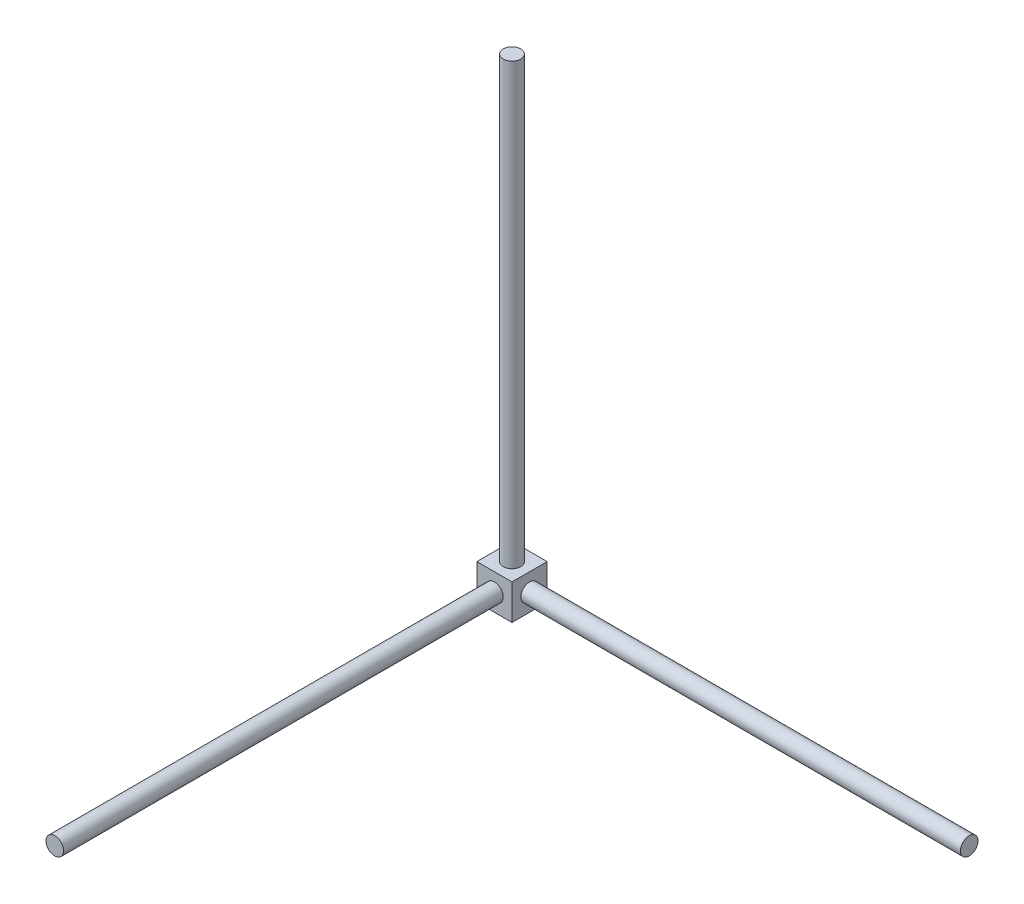
ISO-10303-21;
HEADER;
FILE_DESCRIPTION(('STEP AP214'),'2;1');
FILE_NAME('part.step','',(''),(''),'','','');
FILE_SCHEMA(('AUTOMOTIVE_DESIGN { 1 0 10303 214 1 1 1 1 }'));
ENDSEC;
DATA;
#1=APPLICATION_CONTEXT('core data for automotive mechanical design processes');
#2=APPLICATION_PROTOCOL_DEFINITION('international standard','automotive_design',2000,#1);
#3=PRODUCT_CONTEXT('',#1,'mechanical');
#4=PRODUCT('Part','Part','',(#3));
#5=PRODUCT_RELATED_PRODUCT_CATEGORY('part','',(#4));
#6=PRODUCT_DEFINITION_FORMATION('','',#4);
#7=PRODUCT_DEFINITION_CONTEXT('part definition',#1,'design');
#8=PRODUCT_DEFINITION('design','',#6,#7);
#9=PRODUCT_DEFINITION_SHAPE('','',#8);
#10=(LENGTH_UNIT() NAMED_UNIT(*) SI_UNIT(.MILLI.,.METRE.));
#11=(NAMED_UNIT(*) PLANE_ANGLE_UNIT() SI_UNIT($,.RADIAN.));
#12=(NAMED_UNIT(*) SI_UNIT($,.STERADIAN.) SOLID_ANGLE_UNIT());
#13=UNCERTAINTY_MEASURE_WITH_UNIT(LENGTH_MEASURE(1.E-05),#10,'distance_accuracy_value','');
#14=(GEOMETRIC_REPRESENTATION_CONTEXT(3) GLOBAL_UNCERTAINTY_ASSIGNED_CONTEXT((#13)) GLOBAL_UNIT_ASSIGNED_CONTEXT((#10,
#11,#12)) REPRESENTATION_CONTEXT('',''));
#15=CARTESIAN_POINT('',(0.,0.,0.));
#16=DIRECTION('',(0.,0.,1.));
#17=DIRECTION('',(1.,0.,0.));
#18=AXIS2_PLACEMENT_3D('',#15,#16,#17);
#19=CARTESIAN_POINT('',(-10.,10.,-9.99999999999999));
#20=DIRECTION('',(1.,0.,0.));
#21=DIRECTION('',(0.,0.,-1.));
#22=AXIS2_PLACEMENT_3D('',#19,#20,#21);
#23=PLANE('',#22);
#24=DIRECTION('',(0.,0.,1.));
#25=VECTOR('',#24,1.);
#26=CARTESIAN_POINT('',(-10.,-10.,-9.99999999999999));
#27=LINE('',#26,#25);
#28=CARTESIAN_POINT('',(-10.,-10.,-9.99999999999999));
#29=VERTEX_POINT('',#28);
#30=CARTESIAN_POINT('',(-10.,-10.,10.));
#31=VERTEX_POINT('',#30);
#32=EDGE_CURVE('E111',#29,#31,#27,.T.);
#33=ORIENTED_EDGE('',*,*,#32,.T.);
#34=DIRECTION('',(0.,-1.,0.));
#35=VECTOR('',#34,1.);
#36=CARTESIAN_POINT('',(-10.,10.,10.));
#37=LINE('',#36,#35);
#38=CARTESIAN_POINT('',(-10.,10.,10.));
#39=VERTEX_POINT('',#38);
#40=EDGE_CURVE('E42',#39,#31,#37,.T.);
#41=ORIENTED_EDGE('',*,*,#40,.F.);
#42=DIRECTION('',(0.,0.,1.));
#43=VECTOR('',#42,1.);
#44=CARTESIAN_POINT('',(-10.,10.,-9.99999999999999));
#45=LINE('',#44,#43);
#46=CARTESIAN_POINT('',(-10.,10.,-9.99999999999999));
#47=VERTEX_POINT('',#46);
#48=EDGE_CURVE('E94',#47,#39,#45,.T.);
#49=ORIENTED_EDGE('',*,*,#48,.F.);
#50=DIRECTION('',(0.,-1.,0.));
#51=VECTOR('',#50,1.);
#52=CARTESIAN_POINT('',(-10.,10.,-9.99999999999999));
#53=LINE('',#52,#51);
#54=EDGE_CURVE('E107',#47,#29,#53,.T.);
#55=ORIENTED_EDGE('',*,*,#54,.T.);
#56=EDGE_LOOP('',(#33,#41,#49,#55));
#57=FACE_BOUND('',#56,.T.);
#58=ADVANCED_FACE('F39',(#57),#23,.F.);
#59=CARTESIAN_POINT('',(10.,10.,10.));
#60=DIRECTION('',(0.,0.,-1.));
#61=DIRECTION('',(-1.,0.,0.));
#62=AXIS2_PLACEMENT_3D('',#59,#60,#61);
#63=PLANE('',#62);
#64=CARTESIAN_POINT('',(0.,0.,10.));
#65=DIRECTION('',(0.,0.,1.));
#66=DIRECTION('',(1.,0.,0.));
#67=AXIS2_PLACEMENT_3D('',#64,#65,#66);
#68=CIRCLE('',#67,5.);
#69=CARTESIAN_POINT('',(5.,0.,10.));
#70=VERTEX_POINT('',#69);
#71=EDGE_CURVE('E49',#70,#70,#68,.T.);
#72=ORIENTED_EDGE('',*,*,#71,.F.);
#73=EDGE_LOOP('',(#72));
#74=FACE_BOUND('',#73,.T.);
#75=DIRECTION('',(1.,0.,0.));
#76=VECTOR('',#75,1.);
#77=CARTESIAN_POINT('',(10.,-10.,10.));
#78=LINE('',#77,#76);
#79=CARTESIAN_POINT('',(10.,-10.,10.));
#80=VERTEX_POINT('',#79);
#81=EDGE_CURVE('E100',#31,#80,#78,.T.);
#82=ORIENTED_EDGE('',*,*,#81,.T.);
#83=DIRECTION('',(0.,-1.,0.));
#84=VECTOR('',#83,1.);
#85=CARTESIAN_POINT('',(10.,10.,10.));
#86=LINE('',#85,#84);
#87=CARTESIAN_POINT('',(10.,10.,10.));
#88=VERTEX_POINT('',#87);
#89=EDGE_CURVE('E98',#88,#80,#86,.T.);
#90=ORIENTED_EDGE('',*,*,#89,.F.);
#91=DIRECTION('',(1.,0.,0.));
#92=VECTOR('',#91,1.);
#93=CARTESIAN_POINT('',(10.,10.,10.));
#94=LINE('',#93,#92);
#95=EDGE_CURVE('E89',#39,#88,#94,.T.);
#96=ORIENTED_EDGE('',*,*,#95,.F.);
#97=ORIENTED_EDGE('',*,*,#40,.T.);
#98=EDGE_LOOP('',(#82,#90,#96,#97));
#99=FACE_BOUND('',#98,.T.);
#100=ADVANCED_FACE('F99',(#74,#99),#63,.F.);
#101=CARTESIAN_POINT('',(10.,10.,-10.));
#102=DIRECTION('',(-1.,0.,0.));
#103=DIRECTION('',(0.,0.,1.));
#104=AXIS2_PLACEMENT_3D('',#101,#102,#103);
#105=PLANE('',#104);
#106=CARTESIAN_POINT('',(10.,0.,0.));
#107=DIRECTION('',(1.,0.,0.));
#108=DIRECTION('',(0.,0.,-1.));
#109=AXIS2_PLACEMENT_3D('',#106,#107,#108);
#110=CIRCLE('',#109,5.);
#111=CARTESIAN_POINT('',(10.,0.,-5.));
#112=VERTEX_POINT('',#111);
#113=EDGE_CURVE('E132',#112,#112,#110,.T.);
#114=ORIENTED_EDGE('',*,*,#113,.F.);
#115=EDGE_LOOP('',(#114));
#116=FACE_BOUND('',#115,.T.);
#117=DIRECTION('',(0.,0.,-1.));
#118=VECTOR('',#117,1.);
#119=CARTESIAN_POINT('',(10.,-10.,-10.));
#120=LINE('',#119,#118);
#121=CARTESIAN_POINT('',(10.,-10.,-10.));
#122=VERTEX_POINT('',#121);
#123=EDGE_CURVE('E75',#80,#122,#120,.T.);
#124=ORIENTED_EDGE('',*,*,#123,.T.);
#125=DIRECTION('',(0.,-1.,0.));
#126=VECTOR('',#125,1.);
#127=CARTESIAN_POINT('',(10.,10.,-10.));
#128=LINE('',#127,#126);
#129=CARTESIAN_POINT('',(10.,10.,-10.));
#130=VERTEX_POINT('',#129);
#131=EDGE_CURVE('E102',#130,#122,#128,.T.);
#132=ORIENTED_EDGE('',*,*,#131,.F.);
#133=DIRECTION('',(0.,0.,-1.));
#134=VECTOR('',#133,1.);
#135=CARTESIAN_POINT('',(10.,10.,-10.));
#136=LINE('',#135,#134);
#137=EDGE_CURVE('E92',#88,#130,#136,.T.);
#138=ORIENTED_EDGE('',*,*,#137,.F.);
#139=ORIENTED_EDGE('',*,*,#89,.T.);
#140=EDGE_LOOP('',(#124,#132,#138,#139));
#141=FACE_BOUND('',#140,.T.);
#142=ADVANCED_FACE('F103',(#116,#141),#105,.F.);
#143=CARTESIAN_POINT('',(10.,10.,-10.));
#144=DIRECTION('',(0.,0.,1.));
#145=DIRECTION('',(1.,0.,0.));
#146=AXIS2_PLACEMENT_3D('',#143,#144,#145);
#147=PLANE('',#146);
#148=DIRECTION('',(-1.,0.,0.));
#149=VECTOR('',#148,1.);
#150=CARTESIAN_POINT('',(10.,-10.,-10.));
#151=LINE('',#150,#149);
#152=EDGE_CURVE('E81',#122,#29,#151,.T.);
#153=ORIENTED_EDGE('',*,*,#152,.T.);
#154=ORIENTED_EDGE('',*,*,#54,.F.);
#155=DIRECTION('',(-1.,0.,0.));
#156=VECTOR('',#155,1.);
#157=CARTESIAN_POINT('',(10.,10.,-10.));
#158=LINE('',#157,#156);
#159=EDGE_CURVE('E58',#130,#47,#158,.T.);
#160=ORIENTED_EDGE('',*,*,#159,.F.);
#161=ORIENTED_EDGE('',*,*,#131,.T.);
#162=EDGE_LOOP('',(#153,#154,#160,#161));
#163=FACE_BOUND('',#162,.T.);
#164=ADVANCED_FACE('F125',(#163),#147,.F.);
#165=CARTESIAN_POINT('',(0.,10.,0.));
#166=DIRECTION('',(0.,-1.,0.));
#167=DIRECTION('',(0.,0.,-1.));
#168=AXIS2_PLACEMENT_3D('',#165,#166,#167);
#169=PLANE('',#168);
#170=CARTESIAN_POINT('',(0.,10.,0.));
#171=DIRECTION('',(0.,1.,0.));
#172=DIRECTION('',(0.,0.,1.));
#173=AXIS2_PLACEMENT_3D('',#170,#171,#172);
#174=CIRCLE('',#173,5.);
#175=CARTESIAN_POINT('',(0.,10.,5.));
#176=VERTEX_POINT('',#175);
#177=EDGE_CURVE('E11',#176,#176,#174,.T.);
#178=ORIENTED_EDGE('',*,*,#177,.F.);
#179=EDGE_LOOP('',(#178));
#180=FACE_BOUND('',#179,.T.);
#181=ORIENTED_EDGE('',*,*,#48,.T.);
#182=ORIENTED_EDGE('',*,*,#95,.T.);
#183=ORIENTED_EDGE('',*,*,#137,.T.);
#184=ORIENTED_EDGE('',*,*,#159,.T.);
#185=EDGE_LOOP('',(#181,#182,#183,#184));
#186=FACE_BOUND('',#185,.T.);
#187=ADVANCED_FACE('F90',(#180,#186),#169,.F.);
#188=CARTESIAN_POINT('',(0.,-10.,0.));
#189=DIRECTION('',(0.,-1.,0.));
#190=DIRECTION('',(0.,0.,-1.));
#191=AXIS2_PLACEMENT_3D('',#188,#189,#190);
#192=PLANE('',#191);
#193=ORIENTED_EDGE('',*,*,#32,.F.);
#194=ORIENTED_EDGE('',*,*,#152,.F.);
#195=ORIENTED_EDGE('',*,*,#123,.F.);
#196=ORIENTED_EDGE('',*,*,#81,.F.);
#197=EDGE_LOOP('',(#193,#194,#195,#196));
#198=FACE_BOUND('',#197,.T.);
#199=ADVANCED_FACE('F128',(#198),#192,.T.);
#200=CARTESIAN_POINT('',(260.,0.,0.));
#201=DIRECTION('',(-1.,0.,0.));
#202=DIRECTION('',(0.,0.,1.));
#203=AXIS2_PLACEMENT_3D('',#200,#201,#202);
#204=CYLINDRICAL_SURFACE('',#203,5.);
#205=CARTESIAN_POINT('',(260.,0.,0.));
#206=DIRECTION('',(1.,0.,0.));
#207=DIRECTION('',(0.,0.,-1.));
#208=AXIS2_PLACEMENT_3D('',#205,#206,#207);
#209=CIRCLE('',#208,5.);
#210=CARTESIAN_POINT('',(260.,0.,-5.00000000000002));
#211=VERTEX_POINT('',#210);
#212=EDGE_CURVE('E115',#211,#211,#209,.T.);
#213=ORIENTED_EDGE('',*,*,#212,.F.);
#214=EDGE_LOOP('',(#213));
#215=FACE_BOUND('',#214,.T.);
#216=ORIENTED_EDGE('',*,*,#113,.T.);
#217=EDGE_LOOP('',(#216));
#218=FACE_BOUND('',#217,.T.);
#219=ADVANCED_FACE('F166',(#215,#218),#204,.T.);
#220=CARTESIAN_POINT('',(260.,0.,0.));
#221=DIRECTION('',(1.,0.,0.));
#222=DIRECTION('',(0.,0.,-1.));
#223=AXIS2_PLACEMENT_3D('',#220,#221,#222);
#224=PLANE('',#223);
#225=ORIENTED_EDGE('',*,*,#212,.T.);
#226=EDGE_LOOP('',(#225));
#227=FACE_BOUND('',#226,.T.);
#228=ADVANCED_FACE('F184',(#227),#224,.T.);
#229=CARTESIAN_POINT('',(0.,0.,260.));
#230=DIRECTION('',(0.,0.,-1.));
#231=DIRECTION('',(-1.,0.,0.));
#232=AXIS2_PLACEMENT_3D('',#229,#230,#231);
#233=CYLINDRICAL_SURFACE('',#232,5.);
#234=CARTESIAN_POINT('',(0.,0.,260.));
#235=DIRECTION('',(0.,0.,1.));
#236=DIRECTION('',(1.,0.,0.));
#237=AXIS2_PLACEMENT_3D('',#234,#235,#236);
#238=CIRCLE('',#237,5.);
#239=CARTESIAN_POINT('',(5.,0.,260.));
#240=VERTEX_POINT('',#239);
#241=EDGE_CURVE('E139',#240,#240,#238,.T.);
#242=ORIENTED_EDGE('',*,*,#241,.F.);
#243=EDGE_LOOP('',(#242));
#244=FACE_BOUND('',#243,.T.);
#245=ORIENTED_EDGE('',*,*,#71,.T.);
#246=EDGE_LOOP('',(#245));
#247=FACE_BOUND('',#246,.T.);
#248=ADVANCED_FACE('F182',(#244,#247),#233,.T.);
#249=CARTESIAN_POINT('',(0.,0.,260.));
#250=DIRECTION('',(0.,0.,1.));
#251=DIRECTION('',(1.,0.,0.));
#252=AXIS2_PLACEMENT_3D('',#249,#250,#251);
#253=PLANE('',#252);
#254=ORIENTED_EDGE('',*,*,#241,.T.);
#255=EDGE_LOOP('',(#254));
#256=FACE_BOUND('',#255,.T.);
#257=ADVANCED_FACE('F156',(#256),#253,.T.);
#258=CARTESIAN_POINT('',(0.,260.,0.));
#259=DIRECTION('',(0.,-1.,0.));
#260=DIRECTION('',(0.,0.,-1.));
#261=AXIS2_PLACEMENT_3D('',#258,#259,#260);
#262=CYLINDRICAL_SURFACE('',#261,5.);
#263=CARTESIAN_POINT('',(0.,260.,0.));
#264=DIRECTION('',(0.,1.,0.));
#265=DIRECTION('',(0.,0.,1.));
#266=AXIS2_PLACEMENT_3D('',#263,#264,#265);
#267=CIRCLE('',#266,5.);
#268=CARTESIAN_POINT('',(0.,260.,5.));
#269=VERTEX_POINT('',#268);
#270=EDGE_CURVE('E145',#269,#269,#267,.T.);
#271=ORIENTED_EDGE('',*,*,#270,.F.);
#272=EDGE_LOOP('',(#271));
#273=FACE_BOUND('',#272,.T.);
#274=ORIENTED_EDGE('',*,*,#177,.T.);
#275=EDGE_LOOP('',(#274));
#276=FACE_BOUND('',#275,.T.);
#277=ADVANCED_FACE('F153',(#273,#276),#262,.T.);
#278=CARTESIAN_POINT('',(0.,260.,0.));
#279=DIRECTION('',(0.,1.,0.));
#280=DIRECTION('',(0.,0.,1.));
#281=AXIS2_PLACEMENT_3D('',#278,#279,#280);
#282=PLANE('',#281);
#283=ORIENTED_EDGE('',*,*,#270,.T.);
#284=EDGE_LOOP('',(#283));
#285=FACE_BOUND('',#284,.T.);
#286=ADVANCED_FACE('F151',(#285),#282,.T.);
#287=CLOSED_SHELL('',(#58,#100,#142,#164,#187,#199,#219,#228,#248,#257,#277,#286));
#288=MANIFOLD_SOLID_BREP('B2',#287);
#289=ADVANCED_BREP_SHAPE_REPRESENTATION('',(#18,#288),#14);
#290=SHAPE_DEFINITION_REPRESENTATION(#9,#289);
ENDSEC;
END-ISO-10303-21;
